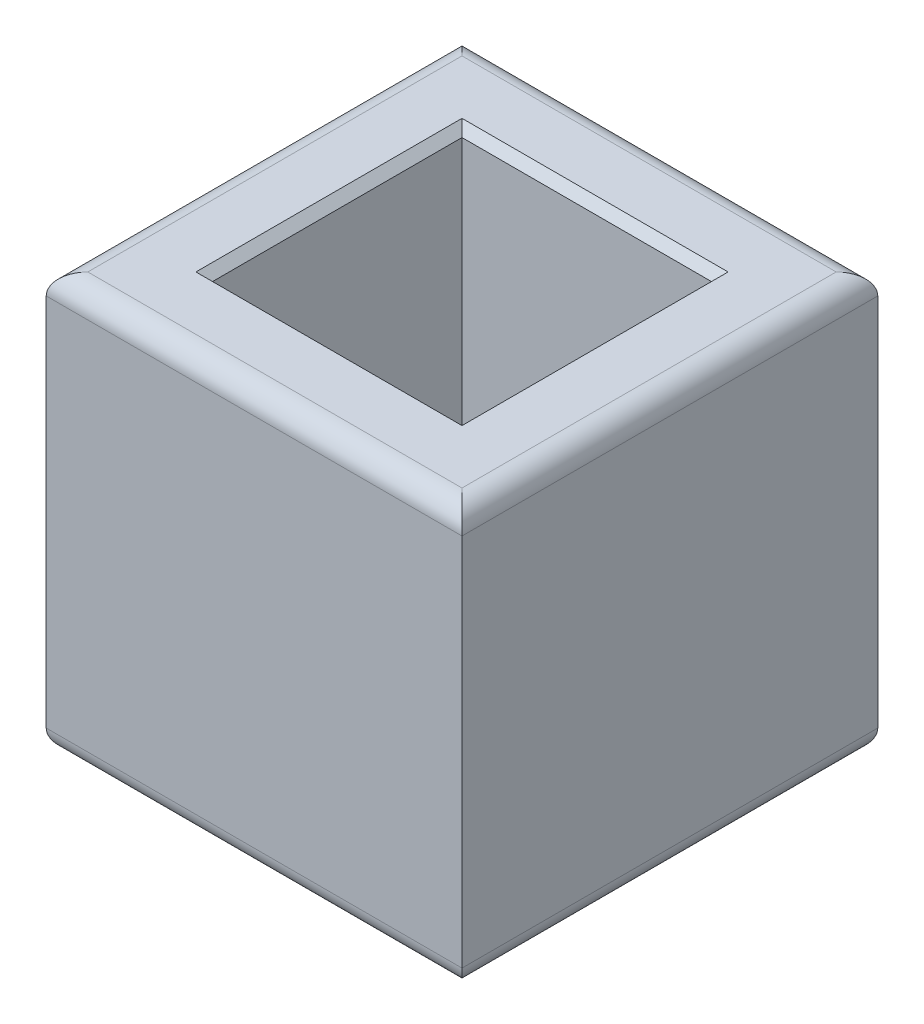
ISO-10303-21;
HEADER;
FILE_DESCRIPTION(('STEP AP214'),'2;1');
FILE_NAME('part.step','',(''),(''),'','','');
FILE_SCHEMA(('AUTOMOTIVE_DESIGN { 1 0 10303 214 1 1 1 1 }'));
ENDSEC;
DATA;
#1=APPLICATION_CONTEXT('core data for automotive mechanical design processes');
#2=APPLICATION_PROTOCOL_DEFINITION('international standard','automotive_design',2000,#1);
#3=PRODUCT_CONTEXT('',#1,'mechanical');
#4=PRODUCT('Part','Part','',(#3));
#5=PRODUCT_RELATED_PRODUCT_CATEGORY('part','',(#4));
#6=PRODUCT_DEFINITION_FORMATION('','',#4);
#7=PRODUCT_DEFINITION_CONTEXT('part definition',#1,'design');
#8=PRODUCT_DEFINITION('design','',#6,#7);
#9=PRODUCT_DEFINITION_SHAPE('','',#8);
#10=(LENGTH_UNIT() NAMED_UNIT(*) SI_UNIT(.MILLI.,.METRE.));
#11=(NAMED_UNIT(*) PLANE_ANGLE_UNIT() SI_UNIT($,.RADIAN.));
#12=(NAMED_UNIT(*) SI_UNIT($,.STERADIAN.) SOLID_ANGLE_UNIT());
#13=UNCERTAINTY_MEASURE_WITH_UNIT(LENGTH_MEASURE(1.E-05),#10,'distance_accuracy_value','');
#14=(GEOMETRIC_REPRESENTATION_CONTEXT(3) GLOBAL_UNCERTAINTY_ASSIGNED_CONTEXT((#13)) GLOBAL_UNIT_ASSIGNED_CONTEXT((#10,
#11,#12)) REPRESENTATION_CONTEXT('',''));
#15=CARTESIAN_POINT('',(0.,0.,0.));
#16=DIRECTION('',(0.,0.,1.));
#17=DIRECTION('',(1.,0.,0.));
#18=AXIS2_PLACEMENT_3D('',#15,#16,#17);
#19=CARTESIAN_POINT('',(63.5,127.,63.5));
#20=DIRECTION('',(-1.,0.,0.));
#21=DIRECTION('',(0.,0.,1.));
#22=AXIS2_PLACEMENT_3D('',#19,#20,#21);
#23=PLANE('',#22);
#24=DIRECTION('',(0.,-1.,0.));
#25=VECTOR('',#24,1.);
#26=CARTESIAN_POINT('',(63.5,127.,-63.5));
#27=LINE('',#26,#25);
#28=CARTESIAN_POINT('',(63.5,120.65,-63.5));
#29=VERTEX_POINT('',#28);
#30=CARTESIAN_POINT('',(63.5,6.34999999999999,-63.5));
#31=VERTEX_POINT('',#30);
#32=EDGE_CURVE('E202',#29,#31,#27,.T.);
#33=ORIENTED_EDGE('',*,*,#32,.F.);
#34=DIRECTION('',(0.,0.,-1.));
#35=VECTOR('',#34,1.);
#36=CARTESIAN_POINT('',(63.5,120.65,63.5));
#37=LINE('',#36,#35);
#38=CARTESIAN_POINT('',(63.5,120.65,63.5));
#39=VERTEX_POINT('',#38);
#40=EDGE_CURVE('E304',#29,#39,#37,.F.);
#41=ORIENTED_EDGE('',*,*,#40,.T.);
#42=DIRECTION('',(0.,-1.,0.));
#43=VECTOR('',#42,1.);
#44=CARTESIAN_POINT('',(63.5,127.,63.5));
#45=LINE('',#44,#43);
#46=CARTESIAN_POINT('',(63.5,6.34999999999999,63.5));
#47=VERTEX_POINT('',#46);
#48=EDGE_CURVE('E365',#39,#47,#45,.T.);
#49=ORIENTED_EDGE('',*,*,#48,.T.);
#50=DIRECTION('',(0.,0.,-1.));
#51=VECTOR('',#50,1.);
#52=CARTESIAN_POINT('',(63.5,6.34999999999999,-63.5));
#53=LINE('',#52,#51);
#54=EDGE_CURVE('E301',#47,#31,#53,.T.);
#55=ORIENTED_EDGE('',*,*,#54,.T.);
#56=EDGE_LOOP('',(#33,#41,#49,#55));
#57=FACE_BOUND('',#56,.T.);
#58=ADVANCED_FACE('F45',(#57),#23,.F.);
#59=CARTESIAN_POINT('',(-63.5,127.,-63.5));
#60=DIRECTION('',(0.,0.,1.));
#61=DIRECTION('',(1.,0.,0.));
#62=AXIS2_PLACEMENT_3D('',#59,#60,#61);
#63=PLANE('',#62);
#64=DIRECTION('',(0.,-1.,0.));
#65=VECTOR('',#64,1.);
#66=CARTESIAN_POINT('',(-63.5,127.,-63.5));
#67=LINE('',#66,#65);
#68=CARTESIAN_POINT('',(-63.5,120.65,-63.5));
#69=VERTEX_POINT('',#68);
#70=CARTESIAN_POINT('',(-63.5,6.34999999999999,-63.5));
#71=VERTEX_POINT('',#70);
#72=EDGE_CURVE('E209',#69,#71,#67,.T.);
#73=ORIENTED_EDGE('',*,*,#72,.F.);
#74=DIRECTION('',(-1.,0.,0.));
#75=VECTOR('',#74,1.);
#76=CARTESIAN_POINT('',(-63.5,120.65,-63.5));
#77=LINE('',#76,#75);
#78=EDGE_CURVE('E298',#69,#29,#77,.F.);
#79=ORIENTED_EDGE('',*,*,#78,.T.);
#80=ORIENTED_EDGE('',*,*,#32,.T.);
#81=DIRECTION('',(-1.,0.,0.));
#82=VECTOR('',#81,1.);
#83=CARTESIAN_POINT('',(-63.5,6.34999999999999,-63.5));
#84=LINE('',#83,#82);
#85=EDGE_CURVE('E295',#31,#71,#84,.T.);
#86=ORIENTED_EDGE('',*,*,#85,.T.);
#87=EDGE_LOOP('',(#73,#79,#80,#86));
#88=FACE_BOUND('',#87,.T.);
#89=ADVANCED_FACE('F422',(#88),#63,.F.);
#90=CARTESIAN_POINT('',(-63.5,127.,63.5));
#91=DIRECTION('',(1.,0.,0.));
#92=DIRECTION('',(0.,0.,-1.));
#93=AXIS2_PLACEMENT_3D('',#90,#91,#92);
#94=PLANE('',#93);
#95=DIRECTION('',(0.,-1.,0.));
#96=VECTOR('',#95,1.);
#97=CARTESIAN_POINT('',(-63.5,127.,63.5));
#98=LINE('',#97,#96);
#99=CARTESIAN_POINT('',(-63.5,120.65,63.5));
#100=VERTEX_POINT('',#99);
#101=CARTESIAN_POINT('',(-63.5,6.34999999999999,63.5));
#102=VERTEX_POINT('',#101);
#103=EDGE_CURVE('E360',#100,#102,#98,.T.);
#104=ORIENTED_EDGE('',*,*,#103,.F.);
#105=DIRECTION('',(0.,0.,1.));
#106=VECTOR('',#105,1.);
#107=CARTESIAN_POINT('',(-63.5,120.65,63.5));
#108=LINE('',#107,#106);
#109=EDGE_CURVE('E292',#100,#69,#108,.F.);
#110=ORIENTED_EDGE('',*,*,#109,.T.);
#111=ORIENTED_EDGE('',*,*,#72,.T.);
#112=DIRECTION('',(0.,0.,1.));
#113=VECTOR('',#112,1.);
#114=CARTESIAN_POINT('',(-63.5,6.34999999999999,63.5));
#115=LINE('',#114,#113);
#116=EDGE_CURVE('E288',#71,#102,#115,.T.);
#117=ORIENTED_EDGE('',*,*,#116,.T.);
#118=EDGE_LOOP('',(#104,#110,#111,#117));
#119=FACE_BOUND('',#118,.T.);
#120=ADVANCED_FACE('F359',(#119),#94,.F.);
#121=CARTESIAN_POINT('',(-63.5,127.,63.5));
#122=DIRECTION('',(0.,0.,-1.));
#123=DIRECTION('',(-1.,0.,0.));
#124=AXIS2_PLACEMENT_3D('',#121,#122,#123);
#125=PLANE('',#124);
#126=ORIENTED_EDGE('',*,*,#48,.F.);
#127=DIRECTION('',(1.,0.,0.));
#128=VECTOR('',#127,1.);
#129=CARTESIAN_POINT('',(-63.5,120.65,63.5));
#130=LINE('',#129,#128);
#131=EDGE_CURVE('E284',#39,#100,#130,.F.);
#132=ORIENTED_EDGE('',*,*,#131,.T.);
#133=ORIENTED_EDGE('',*,*,#103,.T.);
#134=DIRECTION('',(1.,0.,0.));
#135=VECTOR('',#134,1.);
#136=CARTESIAN_POINT('',(63.5,6.34999999999999,63.5));
#137=LINE('',#136,#135);
#138=EDGE_CURVE('E281',#102,#47,#137,.T.);
#139=ORIENTED_EDGE('',*,*,#138,.T.);
#140=EDGE_LOOP('',(#126,#132,#133,#139));
#141=FACE_BOUND('',#140,.T.);
#142=ADVANCED_FACE('F362',(#141),#125,.F.);
#143=CARTESIAN_POINT('',(0.,127.,0.));
#144=DIRECTION('',(0.,-1.,0.));
#145=DIRECTION('',(0.,0.,-1.));
#146=AXIS2_PLACEMENT_3D('',#143,#144,#145);
#147=PLANE('',#146);
#148=DIRECTION('',(0.,0.,1.));
#149=VECTOR('',#148,1.);
#150=CARTESIAN_POINT('',(-57.15,127.,0.));
#151=LINE('',#150,#149);
#152=CARTESIAN_POINT('',(-57.15,127.,-57.15));
#153=VERTEX_POINT('',#152);
#154=CARTESIAN_POINT('',(-57.15,127.,57.15));
#155=VERTEX_POINT('',#154);
#156=EDGE_CURVE('E274',#153,#155,#151,.T.);
#157=ORIENTED_EDGE('',*,*,#156,.T.);
#158=DIRECTION('',(1.,0.,0.));
#159=VECTOR('',#158,1.);
#160=CARTESIAN_POINT('',(0.,127.,57.15));
#161=LINE('',#160,#159);
#162=CARTESIAN_POINT('',(57.15,127.,57.15));
#163=VERTEX_POINT('',#162);
#164=EDGE_CURVE('E277',#155,#163,#161,.T.);
#165=ORIENTED_EDGE('',*,*,#164,.T.);
#166=DIRECTION('',(0.,0.,-1.));
#167=VECTOR('',#166,1.);
#168=CARTESIAN_POINT('',(57.15,127.,0.));
#169=LINE('',#168,#167);
#170=CARTESIAN_POINT('',(57.15,127.,-57.15));
#171=VERTEX_POINT('',#170);
#172=EDGE_CURVE('E251',#163,#171,#169,.T.);
#173=ORIENTED_EDGE('',*,*,#172,.T.);
#174=DIRECTION('',(-1.,0.,0.));
#175=VECTOR('',#174,1.);
#176=CARTESIAN_POINT('',(0.,127.,-57.15));
#177=LINE('',#176,#175);
#178=EDGE_CURVE('E271',#171,#153,#177,.T.);
#179=ORIENTED_EDGE('',*,*,#178,.T.);
#180=EDGE_LOOP('',(#157,#165,#173,#179));
#181=FACE_BOUND('',#180,.T.);
#182=DIRECTION('',(-1.,0.,0.));
#183=VECTOR('',#182,1.);
#184=CARTESIAN_POINT('',(0.,127.,40.64));
#185=LINE('',#184,#183);
#186=CARTESIAN_POINT('',(40.64,127.,40.64));
#187=VERTEX_POINT('',#186);
#188=CARTESIAN_POINT('',(-40.64,127.,40.64));
#189=VERTEX_POINT('',#188);
#190=EDGE_CURVE('E218',#187,#189,#185,.T.);
#191=ORIENTED_EDGE('',*,*,#190,.T.);
#192=DIRECTION('',(0.,0.,-1.));
#193=VECTOR('',#192,1.);
#194=CARTESIAN_POINT('',(-40.64,127.,0.));
#195=LINE('',#194,#193);
#196=CARTESIAN_POINT('',(-40.64,127.,-40.64));
#197=VERTEX_POINT('',#196);
#198=EDGE_CURVE('E173',#189,#197,#195,.T.);
#199=ORIENTED_EDGE('',*,*,#198,.T.);
#200=DIRECTION('',(1.,0.,0.));
#201=VECTOR('',#200,1.);
#202=CARTESIAN_POINT('',(0.,127.,-40.64));
#203=LINE('',#202,#201);
#204=CARTESIAN_POINT('',(40.64,127.,-40.64));
#205=VERTEX_POINT('',#204);
#206=EDGE_CURVE('E206',#197,#205,#203,.T.);
#207=ORIENTED_EDGE('',*,*,#206,.T.);
#208=DIRECTION('',(0.,0.,1.));
#209=VECTOR('',#208,1.);
#210=CARTESIAN_POINT('',(40.64,127.,0.));
#211=LINE('',#210,#209);
#212=EDGE_CURVE('E215',#205,#187,#211,.T.);
#213=ORIENTED_EDGE('',*,*,#212,.T.);
#214=EDGE_LOOP('',(#191,#199,#207,#213));
#215=FACE_BOUND('',#214,.T.);
#216=ADVANCED_FACE('F410',(#181,#215),#147,.F.);
#217=CARTESIAN_POINT('',(0.,0.,0.));
#218=DIRECTION('',(0.,-1.,0.));
#219=DIRECTION('',(0.,0.,-1.));
#220=AXIS2_PLACEMENT_3D('',#217,#218,#219);
#221=PLANE('',#220);
#222=DIRECTION('',(1.,0.,0.));
#223=VECTOR('',#222,1.);
#224=CARTESIAN_POINT('',(-63.5,0.,57.15));
#225=LINE('',#224,#223);
#226=CARTESIAN_POINT('',(57.15,0.,57.15));
#227=VERTEX_POINT('',#226);
#228=CARTESIAN_POINT('',(-57.15,0.,57.15));
#229=VERTEX_POINT('',#228);
#230=EDGE_CURVE('E307',#227,#229,#225,.F.);
#231=ORIENTED_EDGE('',*,*,#230,.T.);
#232=DIRECTION('',(0.,0.,1.));
#233=VECTOR('',#232,1.);
#234=CARTESIAN_POINT('',(-57.15,0.,-63.5));
#235=LINE('',#234,#233);
#236=CARTESIAN_POINT('',(-57.15,0.,-57.15));
#237=VERTEX_POINT('',#236);
#238=EDGE_CURVE('E11',#229,#237,#235,.F.);
#239=ORIENTED_EDGE('',*,*,#238,.T.);
#240=DIRECTION('',(-1.,0.,0.));
#241=VECTOR('',#240,1.);
#242=CARTESIAN_POINT('',(63.5,0.,-57.15));
#243=LINE('',#242,#241);
#244=CARTESIAN_POINT('',(57.15,0.,-57.15));
#245=VERTEX_POINT('',#244);
#246=EDGE_CURVE('E55',#237,#245,#243,.F.);
#247=ORIENTED_EDGE('',*,*,#246,.T.);
#248=DIRECTION('',(0.,0.,-1.));
#249=VECTOR('',#248,1.);
#250=CARTESIAN_POINT('',(57.15,0.,63.5));
#251=LINE('',#250,#249);
#252=EDGE_CURVE('E310',#245,#227,#251,.F.);
#253=ORIENTED_EDGE('',*,*,#252,.T.);
#254=EDGE_LOOP('',(#231,#239,#247,#253));
#255=FACE_BOUND('',#254,.T.);
#256=DIRECTION('',(0.,0.,-1.));
#257=VECTOR('',#256,1.);
#258=CARTESIAN_POINT('',(38.1,0.,38.1));
#259=LINE('',#258,#257);
#260=CARTESIAN_POINT('',(38.1,0.,40.64));
#261=VERTEX_POINT('',#260);
#262=CARTESIAN_POINT('',(38.1,0.,-40.64));
#263=VERTEX_POINT('',#262);
#264=EDGE_CURVE('E265',#261,#263,#259,.T.);
#265=ORIENTED_EDGE('',*,*,#264,.T.);
#266=DIRECTION('',(-1.,0.,0.));
#267=VECTOR('',#266,1.);
#268=CARTESIAN_POINT('',(-38.1,0.,-40.64));
#269=LINE('',#268,#267);
#270=CARTESIAN_POINT('',(-40.64,0.,-40.64));
#271=VERTEX_POINT('',#270);
#272=EDGE_CURVE('E240',#263,#271,#269,.T.);
#273=ORIENTED_EDGE('',*,*,#272,.T.);
#274=DIRECTION('',(0.,0.,1.));
#275=VECTOR('',#274,1.);
#276=CARTESIAN_POINT('',(-40.64,0.,38.1));
#277=LINE('',#276,#275);
#278=CARTESIAN_POINT('',(-40.64,0.,40.64));
#279=VERTEX_POINT('',#278);
#280=EDGE_CURVE('E237',#271,#279,#277,.T.);
#281=ORIENTED_EDGE('',*,*,#280,.T.);
#282=DIRECTION('',(1.,0.,0.));
#283=VECTOR('',#282,1.);
#284=CARTESIAN_POINT('',(38.1,0.,40.64));
#285=LINE('',#284,#283);
#286=EDGE_CURVE('E192',#279,#261,#285,.T.);
#287=ORIENTED_EDGE('',*,*,#286,.T.);
#288=EDGE_LOOP('',(#265,#273,#281,#287));
#289=FACE_BOUND('',#288,.T.);
#290=ADVANCED_FACE('F347',(#255,#289),#221,.T.);
#291=CARTESIAN_POINT('',(38.1,0.,38.1));
#292=DIRECTION('',(1.,0.,0.));
#293=DIRECTION('',(0.,0.,-1.));
#294=AXIS2_PLACEMENT_3D('',#291,#292,#293);
#295=PLANE('',#294);
#296=DIRECTION('',(0.,1.,0.));
#297=VECTOR('',#296,1.);
#298=CARTESIAN_POINT('',(38.1,0.,38.1));
#299=LINE('',#298,#297);
#300=CARTESIAN_POINT('',(38.1,2.53999999999999,38.1));
#301=VERTEX_POINT('',#300);
#302=CARTESIAN_POINT('',(38.1,124.46,38.1));
#303=VERTEX_POINT('',#302);
#304=EDGE_CURVE('E167',#301,#303,#299,.T.);
#305=ORIENTED_EDGE('',*,*,#304,.T.);
#306=DIRECTION('',(0.,0.,-1.));
#307=VECTOR('',#306,1.);
#308=CARTESIAN_POINT('',(38.1,124.46,38.1));
#309=LINE('',#308,#307);
#310=CARTESIAN_POINT('',(38.1,124.46,-38.1));
#311=VERTEX_POINT('',#310);
#312=EDGE_CURVE('E226',#303,#311,#309,.T.);
#313=ORIENTED_EDGE('',*,*,#312,.T.);
#314=DIRECTION('',(0.,1.,0.));
#315=VECTOR('',#314,1.);
#316=CARTESIAN_POINT('',(38.1,0.,-38.1));
#317=LINE('',#316,#315);
#318=CARTESIAN_POINT('',(38.1,2.53999999999999,-38.1));
#319=VERTEX_POINT('',#318);
#320=EDGE_CURVE('E371',#319,#311,#317,.T.);
#321=ORIENTED_EDGE('',*,*,#320,.F.);
#322=DIRECTION('',(0.,-0.707106781186548,-0.707106781186548));
#323=VECTOR('',#322,1.);
#324=CARTESIAN_POINT('',(38.1,39.37,-1.26999999999999));
#325=LINE('',#324,#323);
#326=EDGE_CURVE('E244',#319,#263,#325,.T.);
#327=ORIENTED_EDGE('',*,*,#326,.T.);
#328=ORIENTED_EDGE('',*,*,#264,.F.);
#329=DIRECTION('',(0.,0.707106781186548,-0.707106781186548));
#330=VECTOR('',#329,1.);
#331=CARTESIAN_POINT('',(38.1,1.26999999999999,39.37));
#332=LINE('',#331,#330);
#333=EDGE_CURVE('E248',#261,#301,#332,.T.);
#334=ORIENTED_EDGE('',*,*,#333,.T.);
#335=EDGE_LOOP('',(#305,#313,#321,#327,#328,#334));
#336=FACE_BOUND('',#335,.T.);
#337=ADVANCED_FACE('F384',(#336),#295,.F.);
#338=CARTESIAN_POINT('',(-38.1,0.,38.1));
#339=DIRECTION('',(0.,0.,1.));
#340=DIRECTION('',(1.,0.,0.));
#341=AXIS2_PLACEMENT_3D('',#338,#339,#340);
#342=PLANE('',#341);
#343=DIRECTION('',(0.,1.,0.));
#344=VECTOR('',#343,1.);
#345=CARTESIAN_POINT('',(-38.1,0.,38.1));
#346=LINE('',#345,#344);
#347=CARTESIAN_POINT('',(-38.1,2.53999999999999,38.1));
#348=VERTEX_POINT('',#347);
#349=CARTESIAN_POINT('',(-38.1,124.46,38.1));
#350=VERTEX_POINT('',#349);
#351=EDGE_CURVE('E165',#348,#350,#346,.T.);
#352=ORIENTED_EDGE('',*,*,#351,.T.);
#353=DIRECTION('',(1.,0.,0.));
#354=VECTOR('',#353,1.);
#355=CARTESIAN_POINT('',(-38.1,124.46,38.1));
#356=LINE('',#355,#354);
#357=EDGE_CURVE('E172',#350,#303,#356,.T.);
#358=ORIENTED_EDGE('',*,*,#357,.T.);
#359=ORIENTED_EDGE('',*,*,#304,.F.);
#360=DIRECTION('',(-1.,0.,0.));
#361=VECTOR('',#360,1.);
#362=CARTESIAN_POINT('',(-38.1,2.53999999999999,38.1));
#363=LINE('',#362,#361);
#364=EDGE_CURVE('E162',#301,#348,#363,.T.);
#365=ORIENTED_EDGE('',*,*,#364,.T.);
#366=EDGE_LOOP('',(#352,#358,#359,#365));
#367=FACE_BOUND('',#366,.T.);
#368=ADVANCED_FACE('F164',(#367),#342,.F.);
#369=CARTESIAN_POINT('',(-38.1,0.,38.1));
#370=DIRECTION('',(-1.,0.,0.));
#371=DIRECTION('',(0.,0.,1.));
#372=AXIS2_PLACEMENT_3D('',#369,#370,#371);
#373=PLANE('',#372);
#374=DIRECTION('',(0.,1.,0.));
#375=VECTOR('',#374,1.);
#376=CARTESIAN_POINT('',(-38.1,0.,-38.1));
#377=LINE('',#376,#375);
#378=CARTESIAN_POINT('',(-38.1,2.53999999999999,-38.1));
#379=VERTEX_POINT('',#378);
#380=CARTESIAN_POINT('',(-38.1,124.46,-38.1));
#381=VERTEX_POINT('',#380);
#382=EDGE_CURVE('E185',#379,#381,#377,.T.);
#383=ORIENTED_EDGE('',*,*,#382,.T.);
#384=DIRECTION('',(0.,0.,1.));
#385=VECTOR('',#384,1.);
#386=CARTESIAN_POINT('',(-38.1,124.46,38.1));
#387=LINE('',#386,#385);
#388=EDGE_CURVE('E183',#381,#350,#387,.T.);
#389=ORIENTED_EDGE('',*,*,#388,.T.);
#390=ORIENTED_EDGE('',*,*,#351,.F.);
#391=DIRECTION('',(0.,0.,-1.));
#392=VECTOR('',#391,1.);
#393=CARTESIAN_POINT('',(-38.1,2.53999999999999,-38.1));
#394=LINE('',#393,#392);
#395=EDGE_CURVE('E180',#348,#379,#394,.T.);
#396=ORIENTED_EDGE('',*,*,#395,.T.);
#397=EDGE_LOOP('',(#383,#389,#390,#396));
#398=FACE_BOUND('',#397,.T.);
#399=ADVANCED_FACE('F178',(#398),#373,.F.);
#400=CARTESIAN_POINT('',(-38.1,0.,-38.1));
#401=DIRECTION('',(0.,0.,-1.));
#402=DIRECTION('',(-1.,0.,0.));
#403=AXIS2_PLACEMENT_3D('',#400,#401,#402);
#404=PLANE('',#403);
#405=ORIENTED_EDGE('',*,*,#320,.T.);
#406=DIRECTION('',(-1.,0.,0.));
#407=VECTOR('',#406,1.);
#408=CARTESIAN_POINT('',(-38.1,124.46,-38.1));
#409=LINE('',#408,#407);
#410=EDGE_CURVE('E232',#311,#381,#409,.T.);
#411=ORIENTED_EDGE('',*,*,#410,.T.);
#412=ORIENTED_EDGE('',*,*,#382,.F.);
#413=DIRECTION('',(1.,0.,0.));
#414=VECTOR('',#413,1.);
#415=CARTESIAN_POINT('',(38.1,2.53999999999999,-38.1));
#416=LINE('',#415,#414);
#417=EDGE_CURVE('E229',#379,#319,#416,.T.);
#418=ORIENTED_EDGE('',*,*,#417,.T.);
#419=EDGE_LOOP('',(#405,#411,#412,#418));
#420=FACE_BOUND('',#419,.T.);
#421=ADVANCED_FACE('F389',(#420),#404,.F.);
#422=CARTESIAN_POINT('',(38.1,124.46,38.1));
#423=DIRECTION('',(0.707106781186551,-0.707106781186544,0.));
#424=DIRECTION('',(0.,0.,-1.));
#425=AXIS2_PLACEMENT_3D('',#422,#423,#424);
#426=PLANE('',#425);
#427=DIRECTION('',(0.577350269189624,0.57735026918963,0.577350269189624));
#428=VECTOR('',#427,1.);
#429=CARTESIAN_POINT('',(12.7000000000002,99.0599999999999,12.7000000000002));
#430=LINE('',#429,#428);
#431=EDGE_CURVE('E257',#187,#303,#430,.F.);
#432=ORIENTED_EDGE('',*,*,#431,.F.);
#433=ORIENTED_EDGE('',*,*,#212,.F.);
#434=DIRECTION('',(0.577350269189624,0.57735026918963,-0.577350269189624));
#435=VECTOR('',#434,1.);
#436=CARTESIAN_POINT('',(12.7000000000002,99.0599999999999,-12.7000000000002));
#437=LINE('',#436,#435);
#438=EDGE_CURVE('E261',#311,#205,#437,.T.);
#439=ORIENTED_EDGE('',*,*,#438,.F.);
#440=ORIENTED_EDGE('',*,*,#312,.F.);
#441=EDGE_LOOP('',(#432,#433,#439,#440));
#442=FACE_BOUND('',#441,.T.);
#443=ADVANCED_FACE('F407',(#442),#426,.F.);
#444=CARTESIAN_POINT('',(-38.1,124.46,-38.1));
#445=DIRECTION('',(0.,-0.707106781186544,-0.707106781186551));
#446=DIRECTION('',(-1.,0.,0.));
#447=AXIS2_PLACEMENT_3D('',#444,#445,#446);
#448=PLANE('',#447);
#449=ORIENTED_EDGE('',*,*,#438,.T.);
#450=ORIENTED_EDGE('',*,*,#206,.F.);
#451=DIRECTION('',(0.577350269189624,-0.57735026918963,0.577350269189624));
#452=VECTOR('',#451,1.);
#453=CARTESIAN_POINT('',(-12.7000000000002,99.0599999999999,-12.7000000000002));
#454=LINE('',#453,#452);
#455=EDGE_CURVE('E254',#381,#197,#454,.F.);
#456=ORIENTED_EDGE('',*,*,#455,.F.);
#457=ORIENTED_EDGE('',*,*,#410,.F.);
#458=EDGE_LOOP('',(#449,#450,#456,#457));
#459=FACE_BOUND('',#458,.T.);
#460=ADVANCED_FACE('F395',(#459),#448,.F.);
#461=CARTESIAN_POINT('',(-38.1,124.46,38.1));
#462=DIRECTION('',(0.,-0.707106781186544,0.707106781186551));
#463=DIRECTION('',(1.,0.,0.));
#464=AXIS2_PLACEMENT_3D('',#461,#462,#463);
#465=PLANE('',#464);
#466=ORIENTED_EDGE('',*,*,#431,.T.);
#467=ORIENTED_EDGE('',*,*,#357,.F.);
#468=DIRECTION('',(-0.577350269189624,0.57735026918963,0.577350269189624));
#469=VECTOR('',#468,1.);
#470=CARTESIAN_POINT('',(-38.1,124.46,38.1));
#471=LINE('',#470,#469);
#472=EDGE_CURVE('E196',#189,#350,#471,.F.);
#473=ORIENTED_EDGE('',*,*,#472,.F.);
#474=ORIENTED_EDGE('',*,*,#190,.F.);
#475=EDGE_LOOP('',(#466,#467,#473,#474));
#476=FACE_BOUND('',#475,.T.);
#477=ADVANCED_FACE('F403',(#476),#465,.F.);
#478=CARTESIAN_POINT('',(-38.1,124.46,38.1));
#479=DIRECTION('',(-0.707106781186551,-0.707106781186544,0.));
#480=DIRECTION('',(0.,0.,1.));
#481=AXIS2_PLACEMENT_3D('',#478,#479,#480);
#482=PLANE('',#481);
#483=ORIENTED_EDGE('',*,*,#455,.T.);
#484=ORIENTED_EDGE('',*,*,#198,.F.);
#485=ORIENTED_EDGE('',*,*,#472,.T.);
#486=ORIENTED_EDGE('',*,*,#388,.F.);
#487=EDGE_LOOP('',(#483,#484,#485,#486));
#488=FACE_BOUND('',#487,.T.);
#489=ADVANCED_FACE('F398',(#488),#482,.F.);
#490=CARTESIAN_POINT('',(0.,0.,40.64));
#491=DIRECTION('',(0.,-0.707106781186548,-0.707106781186548));
#492=DIRECTION('',(-1.,0.,0.));
#493=AXIS2_PLACEMENT_3D('',#490,#491,#492);
#494=PLANE('',#493);
#495=ORIENTED_EDGE('',*,*,#333,.F.);
#496=ORIENTED_EDGE('',*,*,#286,.F.);
#497=DIRECTION('',(0.577350269189626,0.577350269189626,-0.577350269189626));
#498=VECTOR('',#497,1.);
#499=CARTESIAN_POINT('',(-27.0933333333333,13.5466666666667,27.0933333333333));
#500=LINE('',#499,#498);
#501=EDGE_CURVE('E189',#348,#279,#500,.F.);
#502=ORIENTED_EDGE('',*,*,#501,.F.);
#503=ORIENTED_EDGE('',*,*,#364,.F.);
#504=EDGE_LOOP('',(#495,#496,#502,#503));
#505=FACE_BOUND('',#504,.T.);
#506=ADVANCED_FACE('F190',(#505),#494,.T.);
#507=CARTESIAN_POINT('',(-40.64,0.,0.));
#508=DIRECTION('',(0.707106781186548,-0.707106781186548,0.));
#509=DIRECTION('',(0.,0.,-1.));
#510=AXIS2_PLACEMENT_3D('',#507,#508,#509);
#511=PLANE('',#510);
#512=ORIENTED_EDGE('',*,*,#501,.T.);
#513=ORIENTED_EDGE('',*,*,#280,.F.);
#514=DIRECTION('',(0.577350269189626,0.577350269189626,0.577350269189626));
#515=VECTOR('',#514,1.);
#516=CARTESIAN_POINT('',(-27.0933333333333,13.5466666666667,-27.0933333333333));
#517=LINE('',#516,#515);
#518=EDGE_CURVE('E197',#379,#271,#517,.F.);
#519=ORIENTED_EDGE('',*,*,#518,.F.);
#520=ORIENTED_EDGE('',*,*,#395,.F.);
#521=EDGE_LOOP('',(#512,#513,#519,#520));
#522=FACE_BOUND('',#521,.T.);
#523=ADVANCED_FACE('F200',(#522),#511,.T.);
#524=CARTESIAN_POINT('',(0.,0.,-40.64));
#525=DIRECTION('',(0.,-0.707106781186548,0.707106781186548));
#526=DIRECTION('',(1.,0.,0.));
#527=AXIS2_PLACEMENT_3D('',#524,#525,#526);
#528=PLANE('',#527);
#529=ORIENTED_EDGE('',*,*,#326,.F.);
#530=ORIENTED_EDGE('',*,*,#417,.F.);
#531=ORIENTED_EDGE('',*,*,#518,.T.);
#532=ORIENTED_EDGE('',*,*,#272,.F.);
#533=EDGE_LOOP('',(#529,#530,#531,#532));
#534=FACE_BOUND('',#533,.T.);
#535=ADVANCED_FACE('F387',(#534),#528,.T.);
#536=CARTESIAN_POINT('',(0.,120.65,-57.15));
#537=DIRECTION('',(-1.,0.,0.));
#538=DIRECTION('',(0.,0.,1.));
#539=AXIS2_PLACEMENT_3D('',#536,#537,#538);
#540=CYLINDRICAL_SURFACE('',#539,6.35);
#541=CARTESIAN_POINT('',(57.15,120.65,-57.15));
#542=DIRECTION('',(-0.707106781186547,0.,-0.707106781186547));
#543=DIRECTION('',(0.707106781186547,0.,-0.707106781186547));
#544=AXIS2_PLACEMENT_3D('',#541,#542,#543);
#545=ELLIPSE('',#544,8.98025612106915,6.35);
#546=EDGE_CURVE('E321',#29,#171,#545,.F.);
#547=ORIENTED_EDGE('',*,*,#546,.F.);
#548=ORIENTED_EDGE('',*,*,#78,.F.);
#549=CARTESIAN_POINT('',(-57.15,120.65,-57.15));
#550=DIRECTION('',(-0.707106781186547,0.,0.707106781186547));
#551=DIRECTION('',(-0.707106781186547,0.,-0.707106781186547));
#552=AXIS2_PLACEMENT_3D('',#549,#550,#551);
#553=ELLIPSE('',#552,8.98025612106915,6.35);
#554=EDGE_CURVE('E267',#153,#69,#553,.T.);
#555=ORIENTED_EDGE('',*,*,#554,.F.);
#556=ORIENTED_EDGE('',*,*,#178,.F.);
#557=EDGE_LOOP('',(#547,#548,#555,#556));
#558=FACE_BOUND('',#557,.T.);
#559=ADVANCED_FACE('F460',(#558),#540,.T.);
#560=CARTESIAN_POINT('',(-57.15,120.65,0.));
#561=DIRECTION('',(0.,0.,1.));
#562=DIRECTION('',(1.,0.,0.));
#563=AXIS2_PLACEMENT_3D('',#560,#561,#562);
#564=CYLINDRICAL_SURFACE('',#563,6.35);
#565=ORIENTED_EDGE('',*,*,#554,.T.);
#566=ORIENTED_EDGE('',*,*,#109,.F.);
#567=CARTESIAN_POINT('',(-57.15,120.65,57.15));
#568=DIRECTION('',(0.707106781186547,0.,0.707106781186547));
#569=DIRECTION('',(-0.707106781186547,0.,0.707106781186547));
#570=AXIS2_PLACEMENT_3D('',#567,#568,#569);
#571=ELLIPSE('',#570,8.98025612106915,6.35);
#572=EDGE_CURVE('E318',#155,#100,#571,.T.);
#573=ORIENTED_EDGE('',*,*,#572,.F.);
#574=ORIENTED_EDGE('',*,*,#156,.F.);
#575=EDGE_LOOP('',(#565,#566,#573,#574));
#576=FACE_BOUND('',#575,.T.);
#577=ADVANCED_FACE('F476',(#576),#564,.T.);
#578=CARTESIAN_POINT('',(57.15,120.65,0.));
#579=DIRECTION('',(0.,0.,-1.));
#580=DIRECTION('',(-1.,0.,0.));
#581=AXIS2_PLACEMENT_3D('',#578,#579,#580);
#582=CYLINDRICAL_SURFACE('',#581,6.35);
#583=ORIENTED_EDGE('',*,*,#546,.T.);
#584=ORIENTED_EDGE('',*,*,#172,.F.);
#585=CARTESIAN_POINT('',(57.15,120.65,57.15));
#586=DIRECTION('',(0.707106781186547,0.,-0.707106781186547));
#587=DIRECTION('',(-0.707106781186547,0.,-0.707106781186547));
#588=AXIS2_PLACEMENT_3D('',#585,#586,#587);
#589=ELLIPSE('',#588,8.98025612106915,6.35);
#590=EDGE_CURVE('E315',#39,#163,#589,.F.);
#591=ORIENTED_EDGE('',*,*,#590,.F.);
#592=ORIENTED_EDGE('',*,*,#40,.F.);
#593=EDGE_LOOP('',(#583,#584,#591,#592));
#594=FACE_BOUND('',#593,.T.);
#595=ADVANCED_FACE('F472',(#594),#582,.T.);
#596=CARTESIAN_POINT('',(0.,120.65,57.15));
#597=DIRECTION('',(1.,0.,0.));
#598=DIRECTION('',(0.,0.,-1.));
#599=AXIS2_PLACEMENT_3D('',#596,#597,#598);
#600=CYLINDRICAL_SURFACE('',#599,6.35);
#601=ORIENTED_EDGE('',*,*,#572,.T.);
#602=ORIENTED_EDGE('',*,*,#131,.F.);
#603=ORIENTED_EDGE('',*,*,#590,.T.);
#604=ORIENTED_EDGE('',*,*,#164,.F.);
#605=EDGE_LOOP('',(#601,#602,#603,#604));
#606=FACE_BOUND('',#605,.T.);
#607=ADVANCED_FACE('F469',(#606),#600,.T.);
#608=CARTESIAN_POINT('',(57.15,6.34999999999999,63.5));
#609=DIRECTION('',(0.,0.,1.));
#610=DIRECTION('',(1.,0.,0.));
#611=AXIS2_PLACEMENT_3D('',#608,#609,#610);
#612=CYLINDRICAL_SURFACE('',#611,6.35);
#613=CARTESIAN_POINT('',(57.15,6.34999999999999,57.15));
#614=DIRECTION('',(-0.707106781186547,0.,0.707106781186547));
#615=DIRECTION('',(-0.707106781186547,0.,-0.707106781186547));
#616=AXIS2_PLACEMENT_3D('',#613,#614,#615);
#617=ELLIPSE('',#616,8.98025612106915,6.35);
#618=EDGE_CURVE('E332',#227,#47,#617,.T.);
#619=ORIENTED_EDGE('',*,*,#618,.F.);
#620=ORIENTED_EDGE('',*,*,#252,.F.);
#621=CARTESIAN_POINT('',(57.15,6.34999999999999,-57.15));
#622=DIRECTION('',(0.707106781186547,0.,0.707106781186547));
#623=DIRECTION('',(-0.707106781186547,0.,0.707106781186547));
#624=AXIS2_PLACEMENT_3D('',#621,#622,#623);
#625=ELLIPSE('',#624,8.98025612106915,6.35);
#626=EDGE_CURVE('E49',#31,#245,#625,.F.);
#627=ORIENTED_EDGE('',*,*,#626,.F.);
#628=ORIENTED_EDGE('',*,*,#54,.F.);
#629=EDGE_LOOP('',(#619,#620,#627,#628));
#630=FACE_BOUND('',#629,.T.);
#631=ADVANCED_FACE('F47',(#630),#612,.T.);
#632=CARTESIAN_POINT('',(-63.5,6.34999999999999,-57.15));
#633=DIRECTION('',(1.,0.,0.));
#634=DIRECTION('',(0.,0.,-1.));
#635=AXIS2_PLACEMENT_3D('',#632,#633,#634);
#636=CYLINDRICAL_SURFACE('',#635,6.35);
#637=ORIENTED_EDGE('',*,*,#626,.T.);
#638=ORIENTED_EDGE('',*,*,#246,.F.);
#639=CARTESIAN_POINT('',(-57.15,6.34999999999999,-57.15));
#640=DIRECTION('',(0.707106781186547,0.,-0.707106781186547));
#641=DIRECTION('',(0.707106781186547,0.,0.707106781186547));
#642=AXIS2_PLACEMENT_3D('',#639,#640,#641);
#643=ELLIPSE('',#642,8.98025612106915,6.35);
#644=EDGE_CURVE('E63',#71,#237,#643,.F.);
#645=ORIENTED_EDGE('',*,*,#644,.F.);
#646=ORIENTED_EDGE('',*,*,#85,.F.);
#647=EDGE_LOOP('',(#637,#638,#645,#646));
#648=FACE_BOUND('',#647,.T.);
#649=ADVANCED_FACE('F344',(#648),#636,.T.);
#650=CARTESIAN_POINT('',(-63.5,6.34999999999999,57.15));
#651=DIRECTION('',(-1.,0.,0.));
#652=DIRECTION('',(0.,0.,1.));
#653=AXIS2_PLACEMENT_3D('',#650,#651,#652);
#654=CYLINDRICAL_SURFACE('',#653,6.35);
#655=ORIENTED_EDGE('',*,*,#618,.T.);
#656=ORIENTED_EDGE('',*,*,#138,.F.);
#657=CARTESIAN_POINT('',(-57.15,6.34999999999999,57.15));
#658=DIRECTION('',(-0.707106781186547,0.,-0.707106781186547));
#659=DIRECTION('',(-0.707106781186547,0.,0.707106781186547));
#660=AXIS2_PLACEMENT_3D('',#657,#658,#659);
#661=ELLIPSE('',#660,8.98025612106915,6.35);
#662=EDGE_CURVE('E328',#229,#102,#661,.T.);
#663=ORIENTED_EDGE('',*,*,#662,.F.);
#664=ORIENTED_EDGE('',*,*,#230,.F.);
#665=EDGE_LOOP('',(#655,#656,#663,#664));
#666=FACE_BOUND('',#665,.T.);
#667=ADVANCED_FACE('F351',(#666),#654,.T.);
#668=CARTESIAN_POINT('',(-57.15,6.34999999999999,63.5));
#669=DIRECTION('',(0.,0.,-1.));
#670=DIRECTION('',(-1.,0.,0.));
#671=AXIS2_PLACEMENT_3D('',#668,#669,#670);
#672=CYLINDRICAL_SURFACE('',#671,6.35);
#673=ORIENTED_EDGE('',*,*,#644,.T.);
#674=ORIENTED_EDGE('',*,*,#238,.F.);
#675=ORIENTED_EDGE('',*,*,#662,.T.);
#676=ORIENTED_EDGE('',*,*,#116,.F.);
#677=EDGE_LOOP('',(#673,#674,#675,#676));
#678=FACE_BOUND('',#677,.T.);
#679=ADVANCED_FACE('F350',(#678),#672,.T.);
#680=CLOSED_SHELL('',(#58,#89,#120,#142,#216,#290,#337,#368,#399,#421,#443,#460,#477,#489,#506,
#523,#535,#559,#577,#595,#607,#631,#649,#667,#679));
#681=MANIFOLD_SOLID_BREP('B2',#680);
#682=ADVANCED_BREP_SHAPE_REPRESENTATION('',(#18,#681),#14);
#683=SHAPE_DEFINITION_REPRESENTATION(#9,#682);
ENDSEC;
END-ISO-10303-21;
